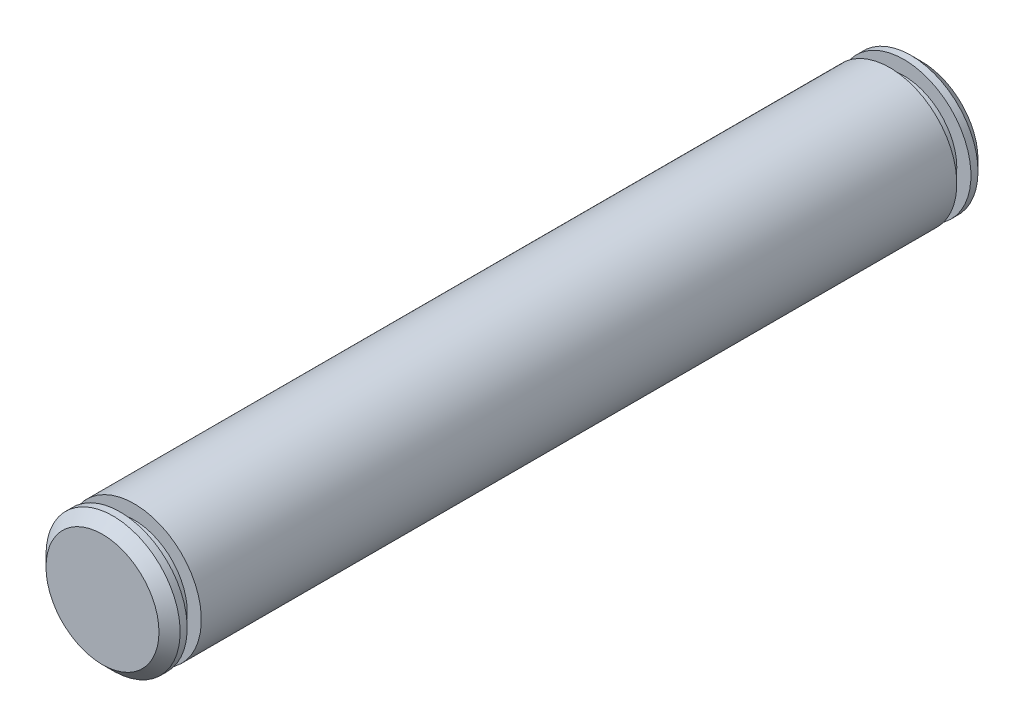
ISO-10303-21;
HEADER;
FILE_DESCRIPTION(('STEP AP214'),'2;1');
FILE_NAME('part.step','',(''),(''),'','','');
FILE_SCHEMA(('AUTOMOTIVE_DESIGN { 1 0 10303 214 1 1 1 1 }'));
ENDSEC;
DATA;
#1=APPLICATION_CONTEXT('core data for automotive mechanical design processes');
#2=APPLICATION_PROTOCOL_DEFINITION('international standard','automotive_design',2000,#1);
#3=PRODUCT_CONTEXT('',#1,'mechanical');
#4=PRODUCT('Part','Part','',(#3));
#5=PRODUCT_RELATED_PRODUCT_CATEGORY('part','',(#4));
#6=PRODUCT_DEFINITION_FORMATION('','',#4);
#7=PRODUCT_DEFINITION_CONTEXT('part definition',#1,'design');
#8=PRODUCT_DEFINITION('design','',#6,#7);
#9=PRODUCT_DEFINITION_SHAPE('','',#8);
#10=(LENGTH_UNIT() NAMED_UNIT(*) SI_UNIT(.MILLI.,.METRE.));
#11=(NAMED_UNIT(*) PLANE_ANGLE_UNIT() SI_UNIT($,.RADIAN.));
#12=(NAMED_UNIT(*) SI_UNIT($,.STERADIAN.) SOLID_ANGLE_UNIT());
#13=UNCERTAINTY_MEASURE_WITH_UNIT(LENGTH_MEASURE(1.E-05),#10,'distance_accuracy_value','');
#14=(GEOMETRIC_REPRESENTATION_CONTEXT(3) GLOBAL_UNCERTAINTY_ASSIGNED_CONTEXT((#13)) GLOBAL_UNIT_ASSIGNED_CONTEXT((#10,
#11,#12)) REPRESENTATION_CONTEXT('',''));
#15=CARTESIAN_POINT('',(0.,0.,0.));
#16=DIRECTION('',(0.,0.,1.));
#17=DIRECTION('',(1.,0.,0.));
#18=AXIS2_PLACEMENT_3D('',#15,#16,#17);
#19=CARTESIAN_POINT('',(0.,0.,116.));
#20=DIRECTION('',(0.,0.,-1.));
#21=DIRECTION('',(-1.,0.,0.));
#22=AXIS2_PLACEMENT_3D('',#19,#20,#21);
#23=CYLINDRICAL_SURFACE('',#22,9.5);
#24=CARTESIAN_POINT('',(0.,0.,4.5));
#25=DIRECTION('',(0.,0.,1.));
#26=DIRECTION('',(1.,0.,0.));
#27=AXIS2_PLACEMENT_3D('',#24,#25,#26);
#28=CIRCLE('',#27,9.5);
#29=CARTESIAN_POINT('',(-9.5,0.,4.5));
#30=VERTEX_POINT('',#29);
#31=EDGE_CURVE('E58',#30,#30,#28,.T.);
#32=CARTESIAN_POINT('',(0.,0.,111.5));
#33=DIRECTION('',(0.,0.,1.));
#34=DIRECTION('',(1.,0.,0.));
#35=AXIS2_PLACEMENT_3D('',#32,#33,#34);
#36=CIRCLE('',#35,9.5);
#37=CARTESIAN_POINT('',(-9.5,0.,111.5));
#38=VERTEX_POINT('',#37);
#39=EDGE_CURVE('E54',#38,#38,#36,.T.);
#40=CARTESIAN_POINT('',(-9.5,0.,4.5));
#41=CARTESIAN_POINT('',(-9.5,0.,5.61458333333334));
#42=CARTESIAN_POINT('',(-9.5,0.,6.72916666666667));
#43=CARTESIAN_POINT('',(-9.5,0.,8.95833333333334));
#44=CARTESIAN_POINT('',(-9.5,0.,10.0729166666667));
#45=CARTESIAN_POINT('',(-9.5,0.,12.3020833333333));
#46=CARTESIAN_POINT('',(-9.5,0.,13.4166666666667));
#47=CARTESIAN_POINT('',(-9.5,0.,15.6458333333333));
#48=CARTESIAN_POINT('',(-9.5,0.,16.7604166666667));
#49=CARTESIAN_POINT('',(-9.5,0.,18.9895833333333));
#50=CARTESIAN_POINT('',(-9.5,0.,20.1041666666667));
#51=CARTESIAN_POINT('',(-9.5,0.,22.3333333333333));
#52=CARTESIAN_POINT('',(-9.5,0.,23.4479166666667));
#53=CARTESIAN_POINT('',(-9.5,0.,25.6770833333333));
#54=CARTESIAN_POINT('',(-9.5,0.,26.7916666666667));
#55=CARTESIAN_POINT('',(-9.5,0.,29.0208333333333));
#56=CARTESIAN_POINT('',(-9.5,0.,30.1354166666667));
#57=CARTESIAN_POINT('',(-9.5,0.,32.3645833333333));
#58=CARTESIAN_POINT('',(-9.5,0.,33.4791666666667));
#59=CARTESIAN_POINT('',(-9.5,0.,35.7083333333333));
#60=CARTESIAN_POINT('',(-9.5,0.,36.8229166666667));
#61=CARTESIAN_POINT('',(-9.5,0.,39.0520833333333));
#62=CARTESIAN_POINT('',(-9.5,0.,40.1666666666667));
#63=CARTESIAN_POINT('',(-9.5,0.,42.3958333333333));
#64=CARTESIAN_POINT('',(-9.5,0.,43.5104166666667));
#65=CARTESIAN_POINT('',(-9.5,0.,45.7395833333333));
#66=CARTESIAN_POINT('',(-9.5,0.,46.8541666666667));
#67=CARTESIAN_POINT('',(-9.5,0.,49.0833333333333));
#68=CARTESIAN_POINT('',(-9.5,0.,50.1979166666667));
#69=CARTESIAN_POINT('',(-9.5,0.,52.4270833333333));
#70=CARTESIAN_POINT('',(-9.5,0.,53.5416666666667));
#71=CARTESIAN_POINT('',(-9.5,0.,55.7708333333333));
#72=CARTESIAN_POINT('',(-9.5,0.,56.8854166666667));
#73=CARTESIAN_POINT('',(-9.5,0.,59.1145833333333));
#74=CARTESIAN_POINT('',(-9.5,0.,60.2291666666667));
#75=CARTESIAN_POINT('',(-9.5,0.,62.4583333333333));
#76=CARTESIAN_POINT('',(-9.5,0.,63.5729166666667));
#77=CARTESIAN_POINT('',(-9.5,0.,65.8020833333333));
#78=CARTESIAN_POINT('',(-9.5,0.,66.9166666666667));
#79=CARTESIAN_POINT('',(-9.5,0.,69.1458333333333));
#80=CARTESIAN_POINT('',(-9.5,0.,70.2604166666667));
#81=CARTESIAN_POINT('',(-9.5,0.,72.4895833333333));
#82=CARTESIAN_POINT('',(-9.5,0.,73.6041666666667));
#83=CARTESIAN_POINT('',(-9.5,0.,75.8333333333333));
#84=CARTESIAN_POINT('',(-9.5,0.,76.9479166666667));
#85=CARTESIAN_POINT('',(-9.5,0.,79.1770833333333));
#86=CARTESIAN_POINT('',(-9.5,0.,80.2916666666667));
#87=CARTESIAN_POINT('',(-9.5,0.,82.5208333333333));
#88=CARTESIAN_POINT('',(-9.5,0.,83.6354166666667));
#89=CARTESIAN_POINT('',(-9.5,0.,85.8645833333333));
#90=CARTESIAN_POINT('',(-9.5,0.,86.9791666666667));
#91=CARTESIAN_POINT('',(-9.5,0.,89.2083333333333));
#92=CARTESIAN_POINT('',(-9.5,0.,90.3229166666667));
#93=CARTESIAN_POINT('',(-9.5,0.,92.5520833333333));
#94=CARTESIAN_POINT('',(-9.5,0.,93.6666666666667));
#95=CARTESIAN_POINT('',(-9.5,0.,95.8958333333333));
#96=CARTESIAN_POINT('',(-9.5,0.,97.0104166666667));
#97=CARTESIAN_POINT('',(-9.5,0.,99.2395833333333));
#98=CARTESIAN_POINT('',(-9.5,0.,100.354166666667));
#99=CARTESIAN_POINT('',(-9.5,0.,102.583333333333));
#100=CARTESIAN_POINT('',(-9.5,0.,103.697916666667));
#101=CARTESIAN_POINT('',(-9.5,0.,105.927083333333));
#102=CARTESIAN_POINT('',(-9.5,0.,107.041666666667));
#103=CARTESIAN_POINT('',(-9.5,0.,109.270833333333));
#104=CARTESIAN_POINT('',(-9.5,0.,110.385416666667));
#105=CARTESIAN_POINT('',(-9.5,0.,111.5));
#106=B_SPLINE_CURVE_WITH_KNOTS('',3,(#40,#41,#42,#43,#44,#45,#46,#47,#48,#49,#50,#51,#52,#53,
#54,#55,#56,#57,#58,#59,#60,#61,#62,#63,#64,#65,#66,#67,#68,#69,#70,#71,#72,#73,#74,#75,#76,#77,
#78,#79,#80,#81,#82,#83,#84,#85,#86,#87,#88,#89,#90,#91,#92,#93,#94,#95,#96,#97,#98,#99,#100,
#101,#102,#103,#104,#105),.UNSPECIFIED.,.F.,.F.,(4,2,2,2,2,2,2,2,2,2,2,2,2,2,2,2,2,2,2,2,2,2,2,
2,2,2,2,2,2,2,2,2,4),(0.,3.34375000000001,6.6875,10.03125,13.375,16.71875,20.0625,23.40625,
26.75,30.09375,33.4375,36.78125,40.125,43.46875,46.8125,50.15625,53.5,56.84375,60.1875,63.53125,
66.875,70.21875,73.5625,76.90625,80.25,83.59375,86.9375,90.28125,93.625,96.96875,100.3125,
103.65625,107.),.UNSPECIFIED.);
#107=EDGE_CURVE('BSEAM34',#30,#38,#106,.T.);
#108=ORIENTED_EDGE('',*,*,#31,.T.);
#109=ORIENTED_EDGE('',*,*,#39,.F.);
#110=ORIENTED_EDGE('',*,*,#107,.T.);
#111=ORIENTED_EDGE('',*,*,#107,.F.);
#112=EDGE_LOOP('',(#108,#110,#109,#111));
#113=FACE_BOUND('',#112,.T.);
#114=ADVANCED_FACE('F34',(#113),#23,.T.);
#115=CARTESIAN_POINT('',(0.,0.,111.5));
#116=DIRECTION('',(0.,0.,1.));
#117=DIRECTION('',(1.,0.,0.));
#118=AXIS2_PLACEMENT_3D('',#115,#116,#117);
#119=PLANE('',#118);
#120=CARTESIAN_POINT('',(0.,0.,111.5));
#121=DIRECTION('',(0.,0.,1.));
#122=DIRECTION('',(1.,0.,0.));
#123=AXIS2_PLACEMENT_3D('',#120,#121,#122);
#124=CIRCLE('',#123,7.5);
#125=CARTESIAN_POINT('',(7.5,0.,111.5));
#126=VERTEX_POINT('',#125);
#127=EDGE_CURVE('E55',#126,#126,#124,.T.);
#128=ORIENTED_EDGE('',*,*,#127,.F.);
#129=EDGE_LOOP('',(#128));
#130=FACE_BOUND('',#129,.T.);
#131=ORIENTED_EDGE('',*,*,#39,.T.);
#132=EDGE_LOOP('',(#131));
#133=FACE_BOUND('',#132,.T.);
#134=ADVANCED_FACE('F98',(#130,#133),#119,.T.);
#135=CARTESIAN_POINT('',(0.,0.,113.5));
#136=DIRECTION('',(0.,0.,1.));
#137=DIRECTION('',(1.,0.,0.));
#138=AXIS2_PLACEMENT_3D('',#135,#136,#137);
#139=PLANE('',#138);
#140=CARTESIAN_POINT('',(0.,0.,113.5));
#141=DIRECTION('',(0.,0.,1.));
#142=DIRECTION('',(1.,0.,0.));
#143=AXIS2_PLACEMENT_3D('',#140,#141,#142);
#144=CIRCLE('',#143,7.5);
#145=CARTESIAN_POINT('',(7.5,0.,113.5));
#146=VERTEX_POINT('',#145);
#147=EDGE_CURVE('E64',#146,#146,#144,.T.);
#148=ORIENTED_EDGE('',*,*,#147,.T.);
#149=EDGE_LOOP('',(#148));
#150=FACE_BOUND('',#149,.T.);
#151=CARTESIAN_POINT('',(0.,0.,113.5));
#152=DIRECTION('',(0.,0.,1.));
#153=DIRECTION('',(1.,0.,0.));
#154=AXIS2_PLACEMENT_3D('',#151,#152,#153);
#155=CIRCLE('',#154,9.5);
#156=CARTESIAN_POINT('',(-9.5,0.,113.5));
#157=VERTEX_POINT('',#156);
#158=EDGE_CURVE('E51',#157,#157,#155,.T.);
#159=ORIENTED_EDGE('',*,*,#158,.F.);
#160=EDGE_LOOP('',(#159));
#161=FACE_BOUND('',#160,.T.);
#162=ADVANCED_FACE('F102',(#150,#161),#139,.F.);
#163=CARTESIAN_POINT('',(0.,0.,111.5));
#164=DIRECTION('',(0.,0.,1.));
#165=DIRECTION('',(1.,0.,0.));
#166=AXIS2_PLACEMENT_3D('',#163,#164,#165);
#167=CYLINDRICAL_SURFACE('',#166,7.5);
#168=ORIENTED_EDGE('',*,*,#127,.T.);
#169=EDGE_LOOP('',(#168));
#170=FACE_BOUND('',#169,.T.);
#171=ORIENTED_EDGE('',*,*,#147,.F.);
#172=EDGE_LOOP('',(#171));
#173=FACE_BOUND('',#172,.T.);
#174=ADVANCED_FACE('F125',(#170,#173),#167,.T.);
#175=CARTESIAN_POINT('',(0.,0.,116.));
#176=DIRECTION('',(0.,0.,1.));
#177=DIRECTION('',(1.,0.,0.));
#178=AXIS2_PLACEMENT_3D('',#175,#176,#177);
#179=PLANE('',#178);
#180=CARTESIAN_POINT('',(0.,0.,116.));
#181=DIRECTION('',(0.,0.,1.));
#182=DIRECTION('',(1.,0.,0.));
#183=AXIS2_PLACEMENT_3D('',#180,#181,#182);
#184=CIRCLE('',#183,8.);
#185=CARTESIAN_POINT('',(8.,0.,116.));
#186=VERTEX_POINT('',#185);
#187=EDGE_CURVE('E57',#186,#186,#184,.T.);
#188=ORIENTED_EDGE('',*,*,#187,.T.);
#189=EDGE_LOOP('',(#188));
#190=FACE_BOUND('',#189,.T.);
#191=ADVANCED_FACE('F116',(#190),#179,.T.);
#192=CARTESIAN_POINT('',(0.,0.,116.));
#193=DIRECTION('',(0.,0.,-1.));
#194=DIRECTION('',(-1.,0.,0.));
#195=AXIS2_PLACEMENT_3D('',#192,#193,#194);
#196=CONICAL_SURFACE('',#195,8.,0.785398163397443);
#197=CARTESIAN_POINT('',(0.,0.,114.5));
#198=DIRECTION('',(0.,0.,1.));
#199=DIRECTION('',(1.,0.,0.));
#200=AXIS2_PLACEMENT_3D('',#197,#198,#199);
#201=CIRCLE('',#200,9.5);
#202=CARTESIAN_POINT('',(-9.5,0.,114.5));
#203=VERTEX_POINT('',#202);
#204=EDGE_CURVE('E42',#203,#203,#201,.F.);
#205=ORIENTED_EDGE('',*,*,#204,.F.);
#206=EDGE_LOOP('',(#205));
#207=FACE_BOUND('',#206,.T.);
#208=ORIENTED_EDGE('',*,*,#187,.F.);
#209=EDGE_LOOP('',(#208));
#210=FACE_BOUND('',#209,.T.);
#211=ADVANCED_FACE('F107',(#207,#210),#196,.T.);
#212=CARTESIAN_POINT('',(-9.5,0.,113.5));
#213=CARTESIAN_POINT('',(-9.5,0.,113.510416666667));
#214=CARTESIAN_POINT('',(-9.5,0.,113.520833333333));
#215=CARTESIAN_POINT('',(-9.5,0.,113.541666666667));
#216=CARTESIAN_POINT('',(-9.5,0.,113.552083333333));
#217=CARTESIAN_POINT('',(-9.5,0.,113.572916666667));
#218=CARTESIAN_POINT('',(-9.5,0.,113.583333333333));
#219=CARTESIAN_POINT('',(-9.5,0.,113.604166666667));
#220=CARTESIAN_POINT('',(-9.5,0.,113.614583333333));
#221=CARTESIAN_POINT('',(-9.5,0.,113.635416666667));
#222=CARTESIAN_POINT('',(-9.5,0.,113.645833333333));
#223=CARTESIAN_POINT('',(-9.5,0.,113.666666666667));
#224=CARTESIAN_POINT('',(-9.5,0.,113.677083333333));
#225=CARTESIAN_POINT('',(-9.5,0.,113.697916666667));
#226=CARTESIAN_POINT('',(-9.5,0.,113.708333333333));
#227=CARTESIAN_POINT('',(-9.5,0.,113.729166666667));
#228=CARTESIAN_POINT('',(-9.5,0.,113.739583333333));
#229=CARTESIAN_POINT('',(-9.5,0.,113.760416666667));
#230=CARTESIAN_POINT('',(-9.5,0.,113.770833333333));
#231=CARTESIAN_POINT('',(-9.5,0.,113.791666666667));
#232=CARTESIAN_POINT('',(-9.5,0.,113.802083333333));
#233=CARTESIAN_POINT('',(-9.5,0.,113.822916666667));
#234=CARTESIAN_POINT('',(-9.5,0.,113.833333333333));
#235=CARTESIAN_POINT('',(-9.5,0.,113.854166666667));
#236=CARTESIAN_POINT('',(-9.5,0.,113.864583333333));
#237=CARTESIAN_POINT('',(-9.5,0.,113.885416666667));
#238=CARTESIAN_POINT('',(-9.5,0.,113.895833333333));
#239=CARTESIAN_POINT('',(-9.5,0.,113.916666666667));
#240=CARTESIAN_POINT('',(-9.5,0.,113.927083333333));
#241=CARTESIAN_POINT('',(-9.5,0.,113.947916666667));
#242=CARTESIAN_POINT('',(-9.5,0.,113.958333333333));
#243=CARTESIAN_POINT('',(-9.5,0.,113.979166666667));
#244=CARTESIAN_POINT('',(-9.5,0.,113.989583333333));
#245=CARTESIAN_POINT('',(-9.5,0.,114.010416666667));
#246=CARTESIAN_POINT('',(-9.5,0.,114.020833333333));
#247=CARTESIAN_POINT('',(-9.5,0.,114.041666666667));
#248=CARTESIAN_POINT('',(-9.5,0.,114.052083333333));
#249=CARTESIAN_POINT('',(-9.5,0.,114.072916666667));
#250=CARTESIAN_POINT('',(-9.5,0.,114.083333333333));
#251=CARTESIAN_POINT('',(-9.5,0.,114.104166666667));
#252=CARTESIAN_POINT('',(-9.5,0.,114.114583333333));
#253=CARTESIAN_POINT('',(-9.5,0.,114.135416666667));
#254=CARTESIAN_POINT('',(-9.5,0.,114.145833333333));
#255=CARTESIAN_POINT('',(-9.5,0.,114.166666666667));
#256=CARTESIAN_POINT('',(-9.5,0.,114.177083333333));
#257=CARTESIAN_POINT('',(-9.5,0.,114.197916666667));
#258=CARTESIAN_POINT('',(-9.5,0.,114.208333333333));
#259=CARTESIAN_POINT('',(-9.5,0.,114.229166666667));
#260=CARTESIAN_POINT('',(-9.5,0.,114.239583333333));
#261=CARTESIAN_POINT('',(-9.5,0.,114.260416666667));
#262=CARTESIAN_POINT('',(-9.5,0.,114.270833333333));
#263=CARTESIAN_POINT('',(-9.5,0.,114.291666666667));
#264=CARTESIAN_POINT('',(-9.5,0.,114.302083333333));
#265=CARTESIAN_POINT('',(-9.5,0.,114.322916666667));
#266=CARTESIAN_POINT('',(-9.5,0.,114.333333333333));
#267=CARTESIAN_POINT('',(-9.5,0.,114.354166666667));
#268=CARTESIAN_POINT('',(-9.5,0.,114.364583333333));
#269=CARTESIAN_POINT('',(-9.5,0.,114.385416666667));
#270=CARTESIAN_POINT('',(-9.5,0.,114.395833333333));
#271=CARTESIAN_POINT('',(-9.5,0.,114.416666666667));
#272=CARTESIAN_POINT('',(-9.5,0.,114.427083333333));
#273=CARTESIAN_POINT('',(-9.5,0.,114.447916666667));
#274=CARTESIAN_POINT('',(-9.5,0.,114.458333333333));
#275=CARTESIAN_POINT('',(-9.5,0.,114.479166666667));
#276=CARTESIAN_POINT('',(-9.5,0.,114.489583333333));
#277=CARTESIAN_POINT('',(-9.5,0.,114.5));
#278=B_SPLINE_CURVE_WITH_KNOTS('',3,(#212,#213,#214,#215,#216,#217,#218,#219,#220,#221,#222,
#223,#224,#225,#226,#227,#228,#229,#230,#231,#232,#233,#234,#235,#236,#237,#238,#239,#240,#241,
#242,#243,#244,#245,#246,#247,#248,#249,#250,#251,#252,#253,#254,#255,#256,#257,#258,#259,#260,
#261,#262,#263,#264,#265,#266,#267,#268,#269,#270,#271,#272,#273,#274,#275,#276,#277),
.UNSPECIFIED.,.F.,.F.,(4,2,2,2,2,2,2,2,2,2,2,2,2,2,2,2,2,2,2,2,2,2,2,2,2,2,2,2,2,2,2,2,4),(0.,
0.0312499999999966,0.0624999999999931,0.0937499999999897,0.124999999999986,0.156249999999997,
0.187499999999993,0.21874999999999,0.249999999999986,0.281249999999997,0.312499999999993,
0.34374999999999,0.374999999999986,0.406249999999983,0.437499999999993,0.46874999999999,
0.499999999999987,0.531249999999983,0.56249999999998,0.59374999999999,0.624999999999987,
0.656249999999983,0.68749999999998,0.71874999999999,0.749999999999987,0.781249999999983,
0.81249999999998,0.843749999999976,0.874999999999987,0.906249999999983,0.93749999999998,
0.968749999999977,0.999999999999973),.UNSPECIFIED.);
#279=EDGE_CURVE('BSEAM36',#157,#203,#278,.T.);
#280=ORIENTED_EDGE('',*,*,#158,.T.);
#281=ORIENTED_EDGE('',*,*,#204,.T.);
#282=ORIENTED_EDGE('',*,*,#279,.T.);
#283=ORIENTED_EDGE('',*,*,#279,.F.);
#284=EDGE_LOOP('',(#280,#282,#281,#283));
#285=FACE_BOUND('',#284,.T.);
#286=ADVANCED_FACE('F36',(#285),#23,.T.);
#287=CARTESIAN_POINT('',(0.,0.,2.5));
#288=DIRECTION('',(0.,0.,1.));
#289=DIRECTION('',(1.,0.,0.));
#290=AXIS2_PLACEMENT_3D('',#287,#288,#289);
#291=PLANE('',#290);
#292=CARTESIAN_POINT('',(0.,0.,2.5));
#293=DIRECTION('',(0.,0.,1.));
#294=DIRECTION('',(1.,0.,0.));
#295=AXIS2_PLACEMENT_3D('',#292,#293,#294);
#296=CIRCLE('',#295,7.5);
#297=CARTESIAN_POINT('',(7.5,0.,2.5));
#298=VERTEX_POINT('',#297);
#299=EDGE_CURVE('E60',#298,#298,#296,.T.);
#300=ORIENTED_EDGE('',*,*,#299,.F.);
#301=EDGE_LOOP('',(#300));
#302=FACE_BOUND('',#301,.T.);
#303=CARTESIAN_POINT('',(0.,0.,2.5));
#304=DIRECTION('',(0.,0.,1.));
#305=DIRECTION('',(1.,0.,0.));
#306=AXIS2_PLACEMENT_3D('',#303,#304,#305);
#307=CIRCLE('',#306,9.5);
#308=CARTESIAN_POINT('',(-9.5,0.,2.5));
#309=VERTEX_POINT('',#308);
#310=EDGE_CURVE('E38',#309,#309,#307,.T.);
#311=ORIENTED_EDGE('',*,*,#310,.T.);
#312=EDGE_LOOP('',(#311));
#313=FACE_BOUND('',#312,.T.);
#314=ADVANCED_FACE('F106',(#302,#313),#291,.T.);
#315=CARTESIAN_POINT('',(0.,0.,4.5));
#316=DIRECTION('',(0.,0.,1.));
#317=DIRECTION('',(1.,0.,0.));
#318=AXIS2_PLACEMENT_3D('',#315,#316,#317);
#319=PLANE('',#318);
#320=CARTESIAN_POINT('',(0.,0.,4.5));
#321=DIRECTION('',(0.,0.,1.));
#322=DIRECTION('',(1.,0.,0.));
#323=AXIS2_PLACEMENT_3D('',#320,#321,#322);
#324=CIRCLE('',#323,7.5);
#325=CARTESIAN_POINT('',(7.5,0.,4.5));
#326=VERTEX_POINT('',#325);
#327=EDGE_CURVE('E66',#326,#326,#324,.T.);
#328=ORIENTED_EDGE('',*,*,#327,.T.);
#329=EDGE_LOOP('',(#328));
#330=FACE_BOUND('',#329,.T.);
#331=ORIENTED_EDGE('',*,*,#31,.F.);
#332=EDGE_LOOP('',(#331));
#333=FACE_BOUND('',#332,.T.);
#334=ADVANCED_FACE('F113',(#330,#333),#319,.F.);
#335=CARTESIAN_POINT('',(0.,0.,2.5));
#336=DIRECTION('',(0.,0.,1.));
#337=DIRECTION('',(1.,0.,0.));
#338=AXIS2_PLACEMENT_3D('',#335,#336,#337);
#339=CYLINDRICAL_SURFACE('',#338,7.5);
#340=ORIENTED_EDGE('',*,*,#299,.T.);
#341=EDGE_LOOP('',(#340));
#342=FACE_BOUND('',#341,.T.);
#343=ORIENTED_EDGE('',*,*,#327,.F.);
#344=EDGE_LOOP('',(#343));
#345=FACE_BOUND('',#344,.T.);
#346=ADVANCED_FACE('F93',(#342,#345),#339,.T.);
#347=CARTESIAN_POINT('',(0.,0.,0.));
#348=DIRECTION('',(0.,0.,1.));
#349=DIRECTION('',(1.,0.,0.));
#350=AXIS2_PLACEMENT_3D('',#347,#348,#349);
#351=PLANE('',#350);
#352=CARTESIAN_POINT('',(0.,0.,0.));
#353=DIRECTION('',(0.,0.,1.));
#354=DIRECTION('',(1.,0.,0.));
#355=AXIS2_PLACEMENT_3D('',#352,#353,#354);
#356=CIRCLE('',#355,7.99999999999997);
#357=CARTESIAN_POINT('',(7.99999999999997,0.,0.));
#358=VERTEX_POINT('',#357);
#359=EDGE_CURVE('E10',#358,#358,#356,.F.);
#360=ORIENTED_EDGE('',*,*,#359,.T.);
#361=EDGE_LOOP('',(#360));
#362=FACE_BOUND('',#361,.T.);
#363=ADVANCED_FACE('F86',(#362),#351,.F.);
#364=CARTESIAN_POINT('',(0.,0.,1.50000000000002));
#365=DIRECTION('',(0.,0.,1.));
#366=DIRECTION('',(1.,0.,0.));
#367=AXIS2_PLACEMENT_3D('',#364,#365,#366);
#368=CONICAL_SURFACE('',#367,9.5,0.785398163397452);
#369=ORIENTED_EDGE('',*,*,#359,.F.);
#370=EDGE_LOOP('',(#369));
#371=FACE_BOUND('',#370,.T.);
#372=CARTESIAN_POINT('',(0.,0.,1.50000000000002));
#373=DIRECTION('',(0.,0.,1.));
#374=DIRECTION('',(1.,0.,0.));
#375=AXIS2_PLACEMENT_3D('',#372,#373,#374);
#376=CIRCLE('',#375,9.5);
#377=CARTESIAN_POINT('',(-9.5,0.,1.5));
#378=VERTEX_POINT('',#377);
#379=EDGE_CURVE('E47',#378,#378,#376,.T.);
#380=ORIENTED_EDGE('',*,*,#379,.F.);
#381=EDGE_LOOP('',(#380));
#382=FACE_BOUND('',#381,.T.);
#383=ADVANCED_FACE('F84',(#371,#382),#368,.T.);
#384=CARTESIAN_POINT('',(-9.5,0.,1.5));
#385=CARTESIAN_POINT('',(-9.5,0.,1.51041666666667));
#386=CARTESIAN_POINT('',(-9.5,0.,1.52083333333333));
#387=CARTESIAN_POINT('',(-9.5,0.,1.54166666666666));
#388=CARTESIAN_POINT('',(-9.5,0.,1.55208333333333));
#389=CARTESIAN_POINT('',(-9.5,0.,1.57291666666666));
#390=CARTESIAN_POINT('',(-9.5,0.,1.58333333333333));
#391=CARTESIAN_POINT('',(-9.5,0.,1.60416666666667));
#392=CARTESIAN_POINT('',(-9.5,0.,1.61458333333334));
#393=CARTESIAN_POINT('',(-9.5,0.,1.63541666666667));
#394=CARTESIAN_POINT('',(-9.5,0.,1.64583333333333));
#395=CARTESIAN_POINT('',(-9.5,0.,1.66666666666667));
#396=CARTESIAN_POINT('',(-9.5,0.,1.67708333333334));
#397=CARTESIAN_POINT('',(-9.5,0.,1.69791666666667));
#398=CARTESIAN_POINT('',(-9.5,0.,1.70833333333334));
#399=CARTESIAN_POINT('',(-9.5,0.,1.72916666666667));
#400=CARTESIAN_POINT('',(-9.5,0.,1.73958333333334));
#401=CARTESIAN_POINT('',(-9.5,0.,1.76041666666667));
#402=CARTESIAN_POINT('',(-9.5,0.,1.77083333333333));
#403=CARTESIAN_POINT('',(-9.5,0.,1.79166666666666));
#404=CARTESIAN_POINT('',(-9.5,0.,1.80208333333333));
#405=CARTESIAN_POINT('',(-9.5,0.,1.82291666666666));
#406=CARTESIAN_POINT('',(-9.5,0.,1.83333333333334));
#407=CARTESIAN_POINT('',(-9.5,0.,1.85416666666667));
#408=CARTESIAN_POINT('',(-9.5,0.,1.86458333333334));
#409=CARTESIAN_POINT('',(-9.5,0.,1.88541666666667));
#410=CARTESIAN_POINT('',(-9.5,0.,1.89583333333333));
#411=CARTESIAN_POINT('',(-9.5,0.,1.91666666666667));
#412=CARTESIAN_POINT('',(-9.5,0.,1.92708333333334));
#413=CARTESIAN_POINT('',(-9.5,0.,1.94791666666667));
#414=CARTESIAN_POINT('',(-9.5,0.,1.95833333333334));
#415=CARTESIAN_POINT('',(-9.5,0.,1.97916666666667));
#416=CARTESIAN_POINT('',(-9.5,0.,1.98958333333334));
#417=CARTESIAN_POINT('',(-9.5,0.,2.01041666666667));
#418=CARTESIAN_POINT('',(-9.5,0.,2.02083333333333));
#419=CARTESIAN_POINT('',(-9.5,0.,2.04166666666666));
#420=CARTESIAN_POINT('',(-9.5,0.,2.05208333333333));
#421=CARTESIAN_POINT('',(-9.5,0.,2.07291666666667));
#422=CARTESIAN_POINT('',(-9.5,0.,2.08333333333334));
#423=CARTESIAN_POINT('',(-9.5,0.,2.10416666666667));
#424=CARTESIAN_POINT('',(-9.5,0.,2.11458333333334));
#425=CARTESIAN_POINT('',(-9.5,0.,2.13541666666667));
#426=CARTESIAN_POINT('',(-9.5,0.,2.14583333333333));
#427=CARTESIAN_POINT('',(-9.5,0.,2.16666666666667));
#428=CARTESIAN_POINT('',(-9.5,0.,2.17708333333334));
#429=CARTESIAN_POINT('',(-9.5,0.,2.19791666666667));
#430=CARTESIAN_POINT('',(-9.5,0.,2.20833333333334));
#431=CARTESIAN_POINT('',(-9.5,0.,2.22916666666667));
#432=CARTESIAN_POINT('',(-9.5,0.,2.23958333333334));
#433=CARTESIAN_POINT('',(-9.5,0.,2.26041666666667));
#434=CARTESIAN_POINT('',(-9.5,0.,2.27083333333333));
#435=CARTESIAN_POINT('',(-9.5,0.,2.29166666666666));
#436=CARTESIAN_POINT('',(-9.5,0.,2.30208333333333));
#437=CARTESIAN_POINT('',(-9.5,0.,2.32291666666667));
#438=CARTESIAN_POINT('',(-9.5,0.,2.33333333333334));
#439=CARTESIAN_POINT('',(-9.5,0.,2.35416666666667));
#440=CARTESIAN_POINT('',(-9.5,0.,2.36458333333334));
#441=CARTESIAN_POINT('',(-9.5,0.,2.38541666666667));
#442=CARTESIAN_POINT('',(-9.5,0.,2.39583333333333));
#443=CARTESIAN_POINT('',(-9.5,0.,2.41666666666667));
#444=CARTESIAN_POINT('',(-9.5,0.,2.42708333333334));
#445=CARTESIAN_POINT('',(-9.5,0.,2.44791666666667));
#446=CARTESIAN_POINT('',(-9.5,0.,2.45833333333334));
#447=CARTESIAN_POINT('',(-9.5,0.,2.47916666666667));
#448=CARTESIAN_POINT('',(-9.5,0.,2.48958333333334));
#449=CARTESIAN_POINT('',(-9.5,0.,2.5));
#450=B_SPLINE_CURVE_WITH_KNOTS('',3,(#384,#385,#386,#387,#388,#389,#390,#391,#392,#393,#394,
#395,#396,#397,#398,#399,#400,#401,#402,#403,#404,#405,#406,#407,#408,#409,#410,#411,#412,#413,
#414,#415,#416,#417,#418,#419,#420,#421,#422,#423,#424,#425,#426,#427,#428,#429,#430,#431,#432,
#433,#434,#435,#436,#437,#438,#439,#440,#441,#442,#443,#444,#445,#446,#447,#448,#449),
.UNSPECIFIED.,.F.,.F.,(4,2,2,2,2,2,2,2,2,2,2,2,2,2,2,2,2,2,2,2,2,2,2,2,2,2,2,2,2,2,2,2,4),(0.,
0.0312499999999966,0.0624999999999931,0.0937500000000036,0.125,0.156249999999997,
0.187500000000007,0.218750000000004,0.25,0.281249999999997,0.312499999999993,0.343750000000004,
0.375,0.406249999999997,0.437500000000007,0.468750000000004,0.5,0.531249999999997,
0.562499999999994,0.593750000000004,0.625000000000001,0.656249999999997,0.687500000000008,
0.718750000000004,0.750000000000001,0.781249999999997,0.812499999999994,0.843750000000004,
0.875000000000001,0.906249999999997,0.937500000000008,0.968750000000004,1.),.UNSPECIFIED.);
#451=EDGE_CURVE('BSEAM81',#378,#309,#450,.T.);
#452=ORIENTED_EDGE('',*,*,#379,.T.);
#453=ORIENTED_EDGE('',*,*,#310,.F.);
#454=ORIENTED_EDGE('',*,*,#451,.T.);
#455=ORIENTED_EDGE('',*,*,#451,.F.);
#456=EDGE_LOOP('',(#452,#454,#453,#455));
#457=FACE_BOUND('',#456,.T.);
#458=ADVANCED_FACE('F81',(#457),#23,.T.);
#459=CLOSED_SHELL('',(#114,#134,#162,#174,#191,#211,#286,#314,#334,#346,#363,#383,#458));
#460=MANIFOLD_SOLID_BREP('B2',#459);
#461=ADVANCED_BREP_SHAPE_REPRESENTATION('',(#18,#460),#14);
#462=SHAPE_DEFINITION_REPRESENTATION(#9,#461);
ENDSEC;
END-ISO-10303-21;
